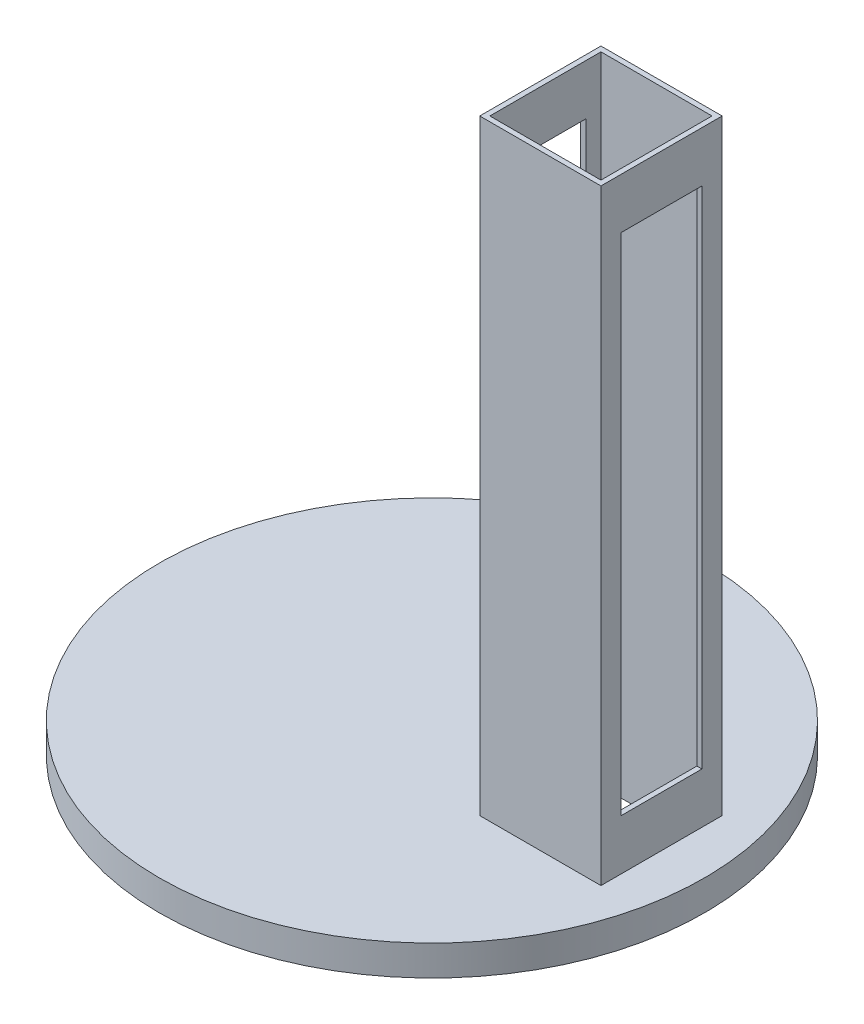
ISO-10303-21;
HEADER;
FILE_DESCRIPTION(('STEP AP214'),'2;1');
FILE_NAME('part.step','',(''),(''),'','','');
FILE_SCHEMA(('AUTOMOTIVE_DESIGN { 1 0 10303 214 1 1 1 1 }'));
ENDSEC;
DATA;
#1=APPLICATION_CONTEXT('core data for automotive mechanical design processes');
#2=APPLICATION_PROTOCOL_DEFINITION('international standard','automotive_design',2000,#1);
#3=PRODUCT_CONTEXT('',#1,'mechanical');
#4=PRODUCT('Part','Part','',(#3));
#5=PRODUCT_RELATED_PRODUCT_CATEGORY('part','',(#4));
#6=PRODUCT_DEFINITION_FORMATION('','',#4);
#7=PRODUCT_DEFINITION_CONTEXT('part definition',#1,'design');
#8=PRODUCT_DEFINITION('design','',#6,#7);
#9=PRODUCT_DEFINITION_SHAPE('','',#8);
#10=(LENGTH_UNIT() NAMED_UNIT(*) SI_UNIT(.MILLI.,.METRE.));
#11=(NAMED_UNIT(*) PLANE_ANGLE_UNIT() SI_UNIT($,.RADIAN.));
#12=(NAMED_UNIT(*) SI_UNIT($,.STERADIAN.) SOLID_ANGLE_UNIT());
#13=UNCERTAINTY_MEASURE_WITH_UNIT(LENGTH_MEASURE(1.E-05),#10,'distance_accuracy_value','');
#14=(GEOMETRIC_REPRESENTATION_CONTEXT(3) GLOBAL_UNCERTAINTY_ASSIGNED_CONTEXT((#13)) GLOBAL_UNIT_ASSIGNED_CONTEXT((#10,
#11,#12)) REPRESENTATION_CONTEXT('',''));
#15=CARTESIAN_POINT('',(0.,0.,0.));
#16=DIRECTION('',(0.,0.,1.));
#17=DIRECTION('',(1.,0.,0.));
#18=AXIS2_PLACEMENT_3D('',#15,#16,#17);
#19=CARTESIAN_POINT('',(0.,3.,0.));
#20=DIRECTION('',(0.,1.,0.));
#21=DIRECTION('',(0.,0.,1.));
#22=AXIS2_PLACEMENT_3D('',#19,#20,#21);
#23=PLANE('',#22);
#24=CARTESIAN_POINT('',(0.,3.,0.));
#25=DIRECTION('',(0.,1.,0.));
#26=DIRECTION('',(0.,0.,1.));
#27=AXIS2_PLACEMENT_3D('',#24,#25,#26);
#28=CIRCLE('',#27,27.);
#29=CARTESIAN_POINT('',(0.,3.,27.));
#30=VERTEX_POINT('',#29);
#31=EDGE_CURVE('E290',#30,#30,#28,.T.);
#32=ORIENTED_EDGE('',*,*,#31,.T.);
#33=EDGE_LOOP('',(#32));
#34=FACE_BOUND('',#33,.T.);
#35=DIRECTION('',(0.,0.,1.));
#36=VECTOR('',#35,1.);
#37=CARTESIAN_POINT('',(22.5279018150798,3.,-6.20837076818439));
#38=LINE('',#37,#36);
#39=CARTESIAN_POINT('',(22.5279018150798,3.,-6.20837076818439));
#40=VERTEX_POINT('',#39);
#41=CARTESIAN_POINT('',(22.5279018150798,3.,5.79162923181561));
#42=VERTEX_POINT('',#41);
#43=EDGE_CURVE('E254',#40,#42,#38,.T.);
#44=ORIENTED_EDGE('',*,*,#43,.T.);
#45=DIRECTION('',(1.,0.,0.));
#46=VECTOR('',#45,1.);
#47=CARTESIAN_POINT('',(10.5279018150798,3.,5.79162923181561));
#48=LINE('',#47,#46);
#49=CARTESIAN_POINT('',(10.5279018150798,3.,5.79162923181561));
#50=VERTEX_POINT('',#49);
#51=EDGE_CURVE('E239',#50,#42,#48,.T.);
#52=ORIENTED_EDGE('',*,*,#51,.F.);
#53=DIRECTION('',(0.,0.,1.));
#54=VECTOR('',#53,1.);
#55=CARTESIAN_POINT('',(10.5279018150798,3.,-6.20837076818439));
#56=LINE('',#55,#54);
#57=CARTESIAN_POINT('',(10.5279018150798,3.,-6.20837076818439));
#58=VERTEX_POINT('',#57);
#59=EDGE_CURVE('E243',#58,#50,#56,.T.);
#60=ORIENTED_EDGE('',*,*,#59,.F.);
#61=DIRECTION('',(1.,0.,0.));
#62=VECTOR('',#61,1.);
#63=CARTESIAN_POINT('',(10.5279018150798,3.,-6.20837076818439));
#64=LINE('',#63,#62);
#65=EDGE_CURVE('E257',#58,#40,#64,.T.);
#66=ORIENTED_EDGE('',*,*,#65,.T.);
#67=EDGE_LOOP('',(#44,#52,#60,#66));
#68=FACE_BOUND('',#67,.T.);
#69=ADVANCED_FACE('F61',(#34,#68),#23,.T.);
#70=CARTESIAN_POINT('',(0.,3.,0.));
#71=DIRECTION('',(0.,-1.,0.));
#72=DIRECTION('',(0.,0.,-1.));
#73=AXIS2_PLACEMENT_3D('',#70,#71,#72);
#74=CYLINDRICAL_SURFACE('',#73,27.);
#75=ORIENTED_EDGE('',*,*,#31,.F.);
#76=EDGE_LOOP('',(#75));
#77=FACE_BOUND('',#76,.T.);
#78=CARTESIAN_POINT('',(0.,0.,0.));
#79=DIRECTION('',(0.,1.,0.));
#80=DIRECTION('',(0.,0.,1.));
#81=AXIS2_PLACEMENT_3D('',#78,#79,#80);
#82=CIRCLE('',#81,27.);
#83=CARTESIAN_POINT('',(0.,0.,27.));
#84=VERTEX_POINT('',#83);
#85=EDGE_CURVE('E284',#84,#84,#82,.T.);
#86=ORIENTED_EDGE('',*,*,#85,.T.);
#87=EDGE_LOOP('',(#86));
#88=FACE_BOUND('',#87,.T.);
#89=ADVANCED_FACE('F63',(#77,#88),#74,.T.);
#90=CARTESIAN_POINT('',(0.,0.,0.));
#91=DIRECTION('',(0.,1.,0.));
#92=DIRECTION('',(0.,0.,1.));
#93=AXIS2_PLACEMENT_3D('',#90,#91,#92);
#94=PLANE('',#93);
#95=DIRECTION('',(0.,0.,-1.));
#96=VECTOR('',#95,1.);
#97=CARTESIAN_POINT('',(22.0279018150798,0.,5.29162923181561));
#98=LINE('',#97,#96);
#99=CARTESIAN_POINT('',(22.0279018150798,0.,5.29162923181561));
#100=VERTEX_POINT('',#99);
#101=CARTESIAN_POINT('',(22.0279018150798,0.,-5.70837076818439));
#102=VERTEX_POINT('',#101);
#103=EDGE_CURVE('E278',#100,#102,#98,.T.);
#104=ORIENTED_EDGE('',*,*,#103,.T.);
#105=DIRECTION('',(-1.,0.,0.));
#106=VECTOR('',#105,1.);
#107=CARTESIAN_POINT('',(22.0279018150798,0.,-5.70837076818439));
#108=LINE('',#107,#106);
#109=CARTESIAN_POINT('',(11.0279018150798,0.,-5.70837076818439));
#110=VERTEX_POINT('',#109);
#111=EDGE_CURVE('E270',#102,#110,#108,.T.);
#112=ORIENTED_EDGE('',*,*,#111,.T.);
#113=DIRECTION('',(0.,0.,-1.));
#114=VECTOR('',#113,1.);
#115=CARTESIAN_POINT('',(11.0279018150798,0.,5.29162923181561));
#116=LINE('',#115,#114);
#117=CARTESIAN_POINT('',(11.0279018150798,0.,5.29162923181561));
#118=VERTEX_POINT('',#117);
#119=EDGE_CURVE('E273',#118,#110,#116,.T.);
#120=ORIENTED_EDGE('',*,*,#119,.F.);
#121=DIRECTION('',(-1.,0.,0.));
#122=VECTOR('',#121,1.);
#123=CARTESIAN_POINT('',(22.0279018150798,0.,5.29162923181561));
#124=LINE('',#123,#122);
#125=EDGE_CURVE('E275',#100,#118,#124,.T.);
#126=ORIENTED_EDGE('',*,*,#125,.F.);
#127=EDGE_LOOP('',(#104,#112,#120,#126));
#128=FACE_BOUND('',#127,.T.);
#129=ORIENTED_EDGE('',*,*,#85,.F.);
#130=EDGE_LOOP('',(#129));
#131=FACE_BOUND('',#130,.T.);
#132=ADVANCED_FACE('F339',(#128,#131),#94,.F.);
#133=CARTESIAN_POINT('',(22.0279018150798,0.,-5.70837076818439));
#134=DIRECTION('',(0.,0.,-1.));
#135=DIRECTION('',(-1.,0.,0.));
#136=AXIS2_PLACEMENT_3D('',#133,#134,#135);
#137=PLANE('',#136);
#138=DIRECTION('',(0.,1.,0.));
#139=VECTOR('',#138,1.);
#140=CARTESIAN_POINT('',(22.0279018150798,0.,-5.70837076818439));
#141=LINE('',#140,#139);
#142=CARTESIAN_POINT('',(22.0279018150798,63.,-5.70837076818439));
#143=VERTEX_POINT('',#142);
#144=EDGE_CURVE('E282',#102,#143,#141,.T.);
#145=ORIENTED_EDGE('',*,*,#144,.T.);
#146=DIRECTION('',(1.,0.,0.));
#147=VECTOR('',#146,1.);
#148=CARTESIAN_POINT('',(11.0279018150798,63.,-5.70837076818439));
#149=LINE('',#148,#147);
#150=CARTESIAN_POINT('',(11.0279018150798,63.,-5.70837076818439));
#151=VERTEX_POINT('',#150);
#152=EDGE_CURVE('E233',#151,#143,#149,.T.);
#153=ORIENTED_EDGE('',*,*,#152,.F.);
#154=DIRECTION('',(0.,1.,0.));
#155=VECTOR('',#154,1.);
#156=CARTESIAN_POINT('',(11.0279018150798,0.,-5.70837076818439));
#157=LINE('',#156,#155);
#158=EDGE_CURVE('E281',#110,#151,#157,.T.);
#159=ORIENTED_EDGE('',*,*,#158,.F.);
#160=ORIENTED_EDGE('',*,*,#111,.F.);
#161=EDGE_LOOP('',(#145,#153,#159,#160));
#162=FACE_BOUND('',#161,.T.);
#163=ADVANCED_FACE('F343',(#162),#137,.F.);
#164=CARTESIAN_POINT('',(22.0279018150798,0.,5.29162923181561));
#165=DIRECTION('',(1.,0.,0.));
#166=DIRECTION('',(0.,0.,-1.));
#167=AXIS2_PLACEMENT_3D('',#164,#165,#166);
#168=PLANE('',#167);
#169=DIRECTION('',(0.,-1.,0.));
#170=VECTOR('',#169,1.);
#171=CARTESIAN_POINT('',(22.0279018150798,0.,3.7916292318156));
#172=LINE('',#171,#170);
#173=CARTESIAN_POINT('',(22.0279018150798,58.,3.79162923181561));
#174=VERTEX_POINT('',#173);
#175=CARTESIAN_POINT('',(22.0279018150798,8.,3.7916292318156));
#176=VERTEX_POINT('',#175);
#177=EDGE_CURVE('E219',#174,#176,#172,.T.);
#178=ORIENTED_EDGE('',*,*,#177,.T.);
#179=DIRECTION('',(0.,0.,-1.));
#180=VECTOR('',#179,1.);
#181=CARTESIAN_POINT('',(22.0279018150798,8.,5.29162923181561));
#182=LINE('',#181,#180);
#183=CARTESIAN_POINT('',(22.0279018150798,8.,-4.2083707681844));
#184=VERTEX_POINT('',#183);
#185=EDGE_CURVE('E224',#176,#184,#182,.T.);
#186=ORIENTED_EDGE('',*,*,#185,.T.);
#187=DIRECTION('',(0.,-1.,0.));
#188=VECTOR('',#187,1.);
#189=CARTESIAN_POINT('',(22.0279018150798,0.,-4.2083707681844));
#190=LINE('',#189,#188);
#191=CARTESIAN_POINT('',(22.0279018150798,58.,-4.20837076818439));
#192=VERTEX_POINT('',#191);
#193=EDGE_CURVE('E211',#192,#184,#190,.T.);
#194=ORIENTED_EDGE('',*,*,#193,.F.);
#195=DIRECTION('',(0.,0.,-1.));
#196=VECTOR('',#195,1.);
#197=CARTESIAN_POINT('',(22.0279018150798,58.,5.29162923181561));
#198=LINE('',#197,#196);
#199=EDGE_CURVE('E179',#174,#192,#198,.T.);
#200=ORIENTED_EDGE('',*,*,#199,.F.);
#201=EDGE_LOOP('',(#178,#186,#194,#200));
#202=FACE_BOUND('',#201,.T.);
#203=DIRECTION('',(0.,1.,0.));
#204=VECTOR('',#203,1.);
#205=CARTESIAN_POINT('',(22.0279018150798,0.,5.29162923181561));
#206=LINE('',#205,#204);
#207=CARTESIAN_POINT('',(22.0279018150798,63.,5.29162923181561));
#208=VERTEX_POINT('',#207);
#209=EDGE_CURVE('E285',#100,#208,#206,.T.);
#210=ORIENTED_EDGE('',*,*,#209,.T.);
#211=DIRECTION('',(0.,0.,1.));
#212=VECTOR('',#211,1.);
#213=CARTESIAN_POINT('',(22.0279018150798,63.,-5.70837076818439));
#214=LINE('',#213,#212);
#215=EDGE_CURVE('E230',#143,#208,#214,.T.);
#216=ORIENTED_EDGE('',*,*,#215,.F.);
#217=ORIENTED_EDGE('',*,*,#144,.F.);
#218=ORIENTED_EDGE('',*,*,#103,.F.);
#219=EDGE_LOOP('',(#210,#216,#217,#218));
#220=FACE_BOUND('',#219,.T.);
#221=ADVANCED_FACE('F350',(#202,#220),#168,.F.);
#222=CARTESIAN_POINT('',(22.0279018150798,0.,5.29162923181561));
#223=DIRECTION('',(0.,0.,-1.));
#224=DIRECTION('',(-1.,0.,0.));
#225=AXIS2_PLACEMENT_3D('',#222,#223,#224);
#226=PLANE('',#225);
#227=DIRECTION('',(0.,1.,0.));
#228=VECTOR('',#227,1.);
#229=CARTESIAN_POINT('',(11.0279018150798,0.,5.29162923181561));
#230=LINE('',#229,#228);
#231=CARTESIAN_POINT('',(11.0279018150798,63.,5.29162923181561));
#232=VERTEX_POINT('',#231);
#233=EDGE_CURVE('E287',#118,#232,#230,.T.);
#234=ORIENTED_EDGE('',*,*,#233,.T.);
#235=DIRECTION('',(1.,0.,0.));
#236=VECTOR('',#235,1.);
#237=CARTESIAN_POINT('',(11.0279018150798,63.,5.29162923181561));
#238=LINE('',#237,#236);
#239=EDGE_CURVE('E227',#232,#208,#238,.T.);
#240=ORIENTED_EDGE('',*,*,#239,.T.);
#241=ORIENTED_EDGE('',*,*,#209,.F.);
#242=ORIENTED_EDGE('',*,*,#125,.T.);
#243=EDGE_LOOP('',(#234,#240,#241,#242));
#244=FACE_BOUND('',#243,.T.);
#245=ADVANCED_FACE('F366',(#244),#226,.T.);
#246=CARTESIAN_POINT('',(11.0279018150798,0.,5.29162923181561));
#247=DIRECTION('',(1.,0.,0.));
#248=DIRECTION('',(0.,0.,-1.));
#249=AXIS2_PLACEMENT_3D('',#246,#247,#248);
#250=PLANE('',#249);
#251=DIRECTION('',(0.,0.,-1.));
#252=VECTOR('',#251,1.);
#253=CARTESIAN_POINT('',(11.0279018150798,8.,5.29162923181561));
#254=LINE('',#253,#252);
#255=CARTESIAN_POINT('',(11.0279018150798,8.,3.7916292318156));
#256=VERTEX_POINT('',#255);
#257=CARTESIAN_POINT('',(11.0279018150798,8.,-4.20837076818439));
#258=VERTEX_POINT('',#257);
#259=EDGE_CURVE('E222',#256,#258,#254,.T.);
#260=ORIENTED_EDGE('',*,*,#259,.F.);
#261=DIRECTION('',(0.,-1.,0.));
#262=VECTOR('',#261,1.);
#263=CARTESIAN_POINT('',(11.0279018150798,0.,3.7916292318156));
#264=LINE('',#263,#262);
#265=CARTESIAN_POINT('',(11.0279018150798,58.,3.79162923181561));
#266=VERTEX_POINT('',#265);
#267=EDGE_CURVE('E217',#266,#256,#264,.T.);
#268=ORIENTED_EDGE('',*,*,#267,.F.);
#269=DIRECTION('',(0.,0.,-1.));
#270=VECTOR('',#269,1.);
#271=CARTESIAN_POINT('',(11.0279018150798,58.,5.29162923181561));
#272=LINE('',#271,#270);
#273=CARTESIAN_POINT('',(11.0279018150798,58.,-4.20837076818439));
#274=VERTEX_POINT('',#273);
#275=EDGE_CURVE('E213',#266,#274,#272,.T.);
#276=ORIENTED_EDGE('',*,*,#275,.T.);
#277=DIRECTION('',(0.,-1.,0.));
#278=VECTOR('',#277,1.);
#279=CARTESIAN_POINT('',(11.0279018150798,0.,-4.2083707681844));
#280=LINE('',#279,#278);
#281=EDGE_CURVE('E208',#274,#258,#280,.T.);
#282=ORIENTED_EDGE('',*,*,#281,.T.);
#283=EDGE_LOOP('',(#260,#268,#276,#282));
#284=FACE_BOUND('',#283,.T.);
#285=ORIENTED_EDGE('',*,*,#158,.T.);
#286=DIRECTION('',(0.,0.,1.));
#287=VECTOR('',#286,1.);
#288=CARTESIAN_POINT('',(11.0279018150798,63.,-5.70837076818439));
#289=LINE('',#288,#287);
#290=EDGE_CURVE('E236',#151,#232,#289,.T.);
#291=ORIENTED_EDGE('',*,*,#290,.T.);
#292=ORIENTED_EDGE('',*,*,#233,.F.);
#293=ORIENTED_EDGE('',*,*,#119,.T.);
#294=EDGE_LOOP('',(#285,#291,#292,#293));
#295=FACE_BOUND('',#294,.T.);
#296=ADVANCED_FACE('F317',(#284,#295),#250,.T.);
#297=CARTESIAN_POINT('',(0.,63.,0.));
#298=DIRECTION('',(0.,-1.,0.));
#299=DIRECTION('',(0.,0.,-1.));
#300=AXIS2_PLACEMENT_3D('',#297,#298,#299);
#301=PLANE('',#300);
#302=DIRECTION('',(1.,0.,0.));
#303=VECTOR('',#302,1.);
#304=CARTESIAN_POINT('',(10.5279018150798,63.,5.79162923181561));
#305=LINE('',#304,#303);
#306=CARTESIAN_POINT('',(10.5279018150798,63.,5.79162923181561));
#307=VERTEX_POINT('',#306);
#308=CARTESIAN_POINT('',(22.5279018150798,63.,5.79162923181561));
#309=VERTEX_POINT('',#308);
#310=EDGE_CURVE('E240',#307,#309,#305,.T.);
#311=ORIENTED_EDGE('',*,*,#310,.T.);
#312=DIRECTION('',(0.,0.,1.));
#313=VECTOR('',#312,1.);
#314=CARTESIAN_POINT('',(22.5279018150798,63.,-6.20837076818439));
#315=LINE('',#314,#313);
#316=CARTESIAN_POINT('',(22.5279018150798,63.,-6.20837076818439));
#317=VERTEX_POINT('',#316);
#318=EDGE_CURVE('E242',#317,#309,#315,.T.);
#319=ORIENTED_EDGE('',*,*,#318,.F.);
#320=DIRECTION('',(1.,0.,0.));
#321=VECTOR('',#320,1.);
#322=CARTESIAN_POINT('',(10.5279018150798,63.,-6.20837076818439));
#323=LINE('',#322,#321);
#324=CARTESIAN_POINT('',(10.5279018150798,63.,-6.20837076818439));
#325=VERTEX_POINT('',#324);
#326=EDGE_CURVE('E246',#325,#317,#323,.T.);
#327=ORIENTED_EDGE('',*,*,#326,.F.);
#328=DIRECTION('',(0.,0.,1.));
#329=VECTOR('',#328,1.);
#330=CARTESIAN_POINT('',(10.5279018150798,63.,-6.20837076818439));
#331=LINE('',#330,#329);
#332=EDGE_CURVE('E249',#325,#307,#331,.T.);
#333=ORIENTED_EDGE('',*,*,#332,.T.);
#334=EDGE_LOOP('',(#311,#319,#327,#333));
#335=FACE_BOUND('',#334,.T.);
#336=ORIENTED_EDGE('',*,*,#239,.F.);
#337=ORIENTED_EDGE('',*,*,#290,.F.);
#338=ORIENTED_EDGE('',*,*,#152,.T.);
#339=ORIENTED_EDGE('',*,*,#215,.T.);
#340=EDGE_LOOP('',(#336,#337,#338,#339));
#341=FACE_BOUND('',#340,.T.);
#342=ADVANCED_FACE('F368',(#335,#341),#301,.F.);
#343=CARTESIAN_POINT('',(10.5279018150798,63.,5.79162923181561));
#344=DIRECTION('',(0.,0.,-1.));
#345=DIRECTION('',(-1.,0.,0.));
#346=AXIS2_PLACEMENT_3D('',#343,#344,#345);
#347=PLANE('',#346);
#348=ORIENTED_EDGE('',*,*,#51,.T.);
#349=DIRECTION('',(0.,-1.,0.));
#350=VECTOR('',#349,1.);
#351=CARTESIAN_POINT('',(22.5279018150798,63.,5.79162923181561));
#352=LINE('',#351,#350);
#353=EDGE_CURVE('E268',#309,#42,#352,.T.);
#354=ORIENTED_EDGE('',*,*,#353,.F.);
#355=ORIENTED_EDGE('',*,*,#310,.F.);
#356=DIRECTION('',(0.,-1.,0.));
#357=VECTOR('',#356,1.);
#358=CARTESIAN_POINT('',(10.5279018150798,63.,5.79162923181561));
#359=LINE('',#358,#357);
#360=EDGE_CURVE('E251',#307,#50,#359,.T.);
#361=ORIENTED_EDGE('',*,*,#360,.T.);
#362=EDGE_LOOP('',(#348,#354,#355,#361));
#363=FACE_BOUND('',#362,.T.);
#364=ADVANCED_FACE('F370',(#363),#347,.F.);
#365=CARTESIAN_POINT('',(22.5279018150798,63.,-6.20837076818439));
#366=DIRECTION('',(1.,0.,0.));
#367=DIRECTION('',(0.,0.,-1.));
#368=AXIS2_PLACEMENT_3D('',#365,#366,#367);
#369=PLANE('',#368);
#370=DIRECTION('',(0.,0.,-1.));
#371=VECTOR('',#370,1.);
#372=CARTESIAN_POINT('',(22.5279018150798,8.,3.7916292318156));
#373=LINE('',#372,#371);
#374=CARTESIAN_POINT('',(22.5279018150798,8.,3.7916292318156));
#375=VERTEX_POINT('',#374);
#376=CARTESIAN_POINT('',(22.5279018150798,8.,-4.2083707681844));
#377=VERTEX_POINT('',#376);
#378=EDGE_CURVE('E191',#375,#377,#373,.T.);
#379=ORIENTED_EDGE('',*,*,#378,.F.);
#380=DIRECTION('',(0.,-1.,0.));
#381=VECTOR('',#380,1.);
#382=CARTESIAN_POINT('',(22.5279018150798,58.,3.79162923181561));
#383=LINE('',#382,#381);
#384=CARTESIAN_POINT('',(22.5279018150798,58.,3.79162923181561));
#385=VERTEX_POINT('',#384);
#386=EDGE_CURVE('E196',#385,#375,#383,.T.);
#387=ORIENTED_EDGE('',*,*,#386,.F.);
#388=DIRECTION('',(0.,0.,-1.));
#389=VECTOR('',#388,1.);
#390=CARTESIAN_POINT('',(22.5279018150798,58.,3.79162923181561));
#391=LINE('',#390,#389);
#392=CARTESIAN_POINT('',(22.5279018150798,58.,-4.20837076818439));
#393=VERTEX_POINT('',#392);
#394=EDGE_CURVE('E176',#385,#393,#391,.T.);
#395=ORIENTED_EDGE('',*,*,#394,.T.);
#396=DIRECTION('',(0.,-1.,0.));
#397=VECTOR('',#396,1.);
#398=CARTESIAN_POINT('',(22.5279018150798,58.,-4.20837076818439));
#399=LINE('',#398,#397);
#400=EDGE_CURVE('E185',#393,#377,#399,.T.);
#401=ORIENTED_EDGE('',*,*,#400,.T.);
#402=EDGE_LOOP('',(#379,#387,#395,#401));
#403=FACE_BOUND('',#402,.T.);
#404=ORIENTED_EDGE('',*,*,#43,.F.);
#405=DIRECTION('',(0.,-1.,0.));
#406=VECTOR('',#405,1.);
#407=CARTESIAN_POINT('',(22.5279018150798,63.,-6.20837076818439));
#408=LINE('',#407,#406);
#409=EDGE_CURVE('E266',#317,#40,#408,.T.);
#410=ORIENTED_EDGE('',*,*,#409,.F.);
#411=ORIENTED_EDGE('',*,*,#318,.T.);
#412=ORIENTED_EDGE('',*,*,#353,.T.);
#413=EDGE_LOOP('',(#404,#410,#411,#412));
#414=FACE_BOUND('',#413,.T.);
#415=ADVANCED_FACE('F193',(#403,#414),#369,.T.);
#416=CARTESIAN_POINT('',(10.5279018150798,63.,-6.20837076818439));
#417=DIRECTION('',(0.,0.,-1.));
#418=DIRECTION('',(-1.,0.,0.));
#419=AXIS2_PLACEMENT_3D('',#416,#417,#418);
#420=PLANE('',#419);
#421=ORIENTED_EDGE('',*,*,#65,.F.);
#422=DIRECTION('',(0.,-1.,0.));
#423=VECTOR('',#422,1.);
#424=CARTESIAN_POINT('',(10.5279018150798,63.,-6.20837076818439));
#425=LINE('',#424,#423);
#426=EDGE_CURVE('E263',#325,#58,#425,.T.);
#427=ORIENTED_EDGE('',*,*,#426,.F.);
#428=ORIENTED_EDGE('',*,*,#326,.T.);
#429=ORIENTED_EDGE('',*,*,#409,.T.);
#430=EDGE_LOOP('',(#421,#427,#428,#429));
#431=FACE_BOUND('',#430,.T.);
#432=ADVANCED_FACE('F382',(#431),#420,.T.);
#433=CARTESIAN_POINT('',(10.5279018150798,63.,-6.20837076818439));
#434=DIRECTION('',(1.,0.,0.));
#435=DIRECTION('',(0.,0.,-1.));
#436=AXIS2_PLACEMENT_3D('',#433,#434,#435);
#437=PLANE('',#436);
#438=DIRECTION('',(0.,-1.,0.));
#439=VECTOR('',#438,1.);
#440=CARTESIAN_POINT('',(10.5279018150798,63.,3.79162923181561));
#441=LINE('',#440,#439);
#442=CARTESIAN_POINT('',(10.5279018150798,58.,3.79162923181561));
#443=VERTEX_POINT('',#442);
#444=CARTESIAN_POINT('',(10.5279018150798,8.,3.7916292318156));
#445=VERTEX_POINT('',#444);
#446=EDGE_CURVE('E69',#443,#445,#441,.T.);
#447=ORIENTED_EDGE('',*,*,#446,.T.);
#448=DIRECTION('',(0.,0.,-1.));
#449=VECTOR('',#448,1.);
#450=CARTESIAN_POINT('',(10.5279018150798,8.,-6.20837076818438));
#451=LINE('',#450,#449);
#452=CARTESIAN_POINT('',(10.5279018150798,8.,-4.2083707681844));
#453=VERTEX_POINT('',#452);
#454=EDGE_CURVE('E12',#445,#453,#451,.T.);
#455=ORIENTED_EDGE('',*,*,#454,.T.);
#456=DIRECTION('',(0.,-1.,0.));
#457=VECTOR('',#456,1.);
#458=CARTESIAN_POINT('',(10.5279018150798,63.,-4.20837076818439));
#459=LINE('',#458,#457);
#460=CARTESIAN_POINT('',(10.5279018150798,58.,-4.20837076818439));
#461=VERTEX_POINT('',#460);
#462=EDGE_CURVE('E293',#461,#453,#459,.T.);
#463=ORIENTED_EDGE('',*,*,#462,.F.);
#464=DIRECTION('',(0.,0.,-1.));
#465=VECTOR('',#464,1.);
#466=CARTESIAN_POINT('',(10.5279018150798,58.,-6.20837076818439));
#467=LINE('',#466,#465);
#468=EDGE_CURVE('E297',#443,#461,#467,.T.);
#469=ORIENTED_EDGE('',*,*,#468,.F.);
#470=EDGE_LOOP('',(#447,#455,#463,#469));
#471=FACE_BOUND('',#470,.T.);
#472=ORIENTED_EDGE('',*,*,#59,.T.);
#473=ORIENTED_EDGE('',*,*,#360,.F.);
#474=ORIENTED_EDGE('',*,*,#332,.F.);
#475=ORIENTED_EDGE('',*,*,#426,.T.);
#476=EDGE_LOOP('',(#472,#473,#474,#475));
#477=FACE_BOUND('',#476,.T.);
#478=ADVANCED_FACE('F302',(#471,#477),#437,.F.);
#479=CARTESIAN_POINT('',(-37.4720981849202,58.,-4.20837076818439));
#480=DIRECTION('',(0.,0.,1.));
#481=DIRECTION('',(0.,-1.,0.));
#482=AXIS2_PLACEMENT_3D('',#479,#480,#481);
#483=PLANE('',#482);
#484=DIRECTION('',(1.,0.,0.));
#485=VECTOR('',#484,1.);
#486=CARTESIAN_POINT('',(-37.4720981849202,58.,-4.20837076818439));
#487=LINE('',#486,#485);
#488=EDGE_CURVE('E181',#461,#274,#487,.T.);
#489=ORIENTED_EDGE('',*,*,#488,.F.);
#490=ORIENTED_EDGE('',*,*,#462,.T.);
#491=DIRECTION('',(1.,0.,0.));
#492=VECTOR('',#491,1.);
#493=CARTESIAN_POINT('',(-37.4720981849202,8.,-4.2083707681844));
#494=LINE('',#493,#492);
#495=EDGE_CURVE('E84',#453,#258,#494,.T.);
#496=ORIENTED_EDGE('',*,*,#495,.T.);
#497=ORIENTED_EDGE('',*,*,#281,.F.);
#498=EDGE_LOOP('',(#489,#490,#496,#497));
#499=FACE_BOUND('',#498,.T.);
#500=ADVANCED_FACE('F381',(#499),#483,.T.);
#501=CARTESIAN_POINT('',(-37.4720981849202,58.,3.79162923181561));
#502=DIRECTION('',(0.,-1.,0.));
#503=DIRECTION('',(0.,0.,-1.));
#504=AXIS2_PLACEMENT_3D('',#501,#502,#503);
#505=PLANE('',#504);
#506=DIRECTION('',(1.,0.,0.));
#507=VECTOR('',#506,1.);
#508=CARTESIAN_POINT('',(-37.4720981849202,58.,3.79162923181561));
#509=LINE('',#508,#507);
#510=EDGE_CURVE('E204',#443,#266,#509,.T.);
#511=ORIENTED_EDGE('',*,*,#510,.F.);
#512=ORIENTED_EDGE('',*,*,#468,.T.);
#513=ORIENTED_EDGE('',*,*,#488,.T.);
#514=ORIENTED_EDGE('',*,*,#275,.F.);
#515=EDGE_LOOP('',(#511,#512,#513,#514));
#516=FACE_BOUND('',#515,.T.);
#517=ADVANCED_FACE('F313',(#516),#505,.T.);
#518=CARTESIAN_POINT('',(-37.4720981849202,58.,3.79162923181561));
#519=DIRECTION('',(0.,0.,1.));
#520=DIRECTION('',(0.,-1.,0.));
#521=AXIS2_PLACEMENT_3D('',#518,#519,#520);
#522=PLANE('',#521);
#523=ORIENTED_EDGE('',*,*,#267,.T.);
#524=DIRECTION('',(1.,0.,0.));
#525=VECTOR('',#524,1.);
#526=CARTESIAN_POINT('',(-37.4720981849202,8.,3.7916292318156));
#527=LINE('',#526,#525);
#528=EDGE_CURVE('E203',#445,#256,#527,.T.);
#529=ORIENTED_EDGE('',*,*,#528,.F.);
#530=ORIENTED_EDGE('',*,*,#446,.F.);
#531=ORIENTED_EDGE('',*,*,#510,.T.);
#532=EDGE_LOOP('',(#523,#529,#530,#531));
#533=FACE_BOUND('',#532,.T.);
#534=ADVANCED_FACE('F309',(#533),#522,.F.);
#535=CARTESIAN_POINT('',(-37.4720981849202,8.,3.7916292318156));
#536=DIRECTION('',(0.,-1.,0.));
#537=DIRECTION('',(0.,0.,-1.));
#538=AXIS2_PLACEMENT_3D('',#535,#536,#537);
#539=PLANE('',#538);
#540=ORIENTED_EDGE('',*,*,#259,.T.);
#541=ORIENTED_EDGE('',*,*,#495,.F.);
#542=ORIENTED_EDGE('',*,*,#454,.F.);
#543=ORIENTED_EDGE('',*,*,#528,.T.);
#544=EDGE_LOOP('',(#540,#541,#542,#543));
#545=FACE_BOUND('',#544,.T.);
#546=ADVANCED_FACE('F320',(#545),#539,.F.);
#547=EDGE_CURVE('E201',#176,#375,#527,.T.);
#548=ORIENTED_EDGE('',*,*,#547,.T.);
#549=ORIENTED_EDGE('',*,*,#378,.T.);
#550=EDGE_CURVE('E188',#184,#377,#494,.T.);
#551=ORIENTED_EDGE('',*,*,#550,.F.);
#552=ORIENTED_EDGE('',*,*,#185,.F.);
#553=EDGE_LOOP('',(#548,#549,#551,#552));
#554=FACE_BOUND('',#553,.T.);
#555=ADVANCED_FACE('F322',(#554),#539,.F.);
#556=EDGE_CURVE('E205',#174,#385,#509,.T.);
#557=ORIENTED_EDGE('',*,*,#556,.T.);
#558=ORIENTED_EDGE('',*,*,#386,.T.);
#559=ORIENTED_EDGE('',*,*,#547,.F.);
#560=ORIENTED_EDGE('',*,*,#177,.F.);
#561=EDGE_LOOP('',(#557,#558,#559,#560));
#562=FACE_BOUND('',#561,.T.);
#563=ADVANCED_FACE('F328',(#562),#522,.F.);
#564=ORIENTED_EDGE('',*,*,#199,.T.);
#565=EDGE_CURVE('E76',#192,#393,#487,.T.);
#566=ORIENTED_EDGE('',*,*,#565,.T.);
#567=ORIENTED_EDGE('',*,*,#394,.F.);
#568=ORIENTED_EDGE('',*,*,#556,.F.);
#569=EDGE_LOOP('',(#564,#566,#567,#568));
#570=FACE_BOUND('',#569,.T.);
#571=ADVANCED_FACE('F173',(#570),#505,.T.);
#572=ORIENTED_EDGE('',*,*,#193,.T.);
#573=ORIENTED_EDGE('',*,*,#550,.T.);
#574=ORIENTED_EDGE('',*,*,#400,.F.);
#575=ORIENTED_EDGE('',*,*,#565,.F.);
#576=EDGE_LOOP('',(#572,#573,#574,#575));
#577=FACE_BOUND('',#576,.T.);
#578=ADVANCED_FACE('F186',(#577),#483,.T.);
#579=CLOSED_SHELL('',(#69,#89,#132,#163,#221,#245,#296,#342,#364,#415,#432,#478,#500,#517,#534,
#546,#555,#563,#571,#578));
#580=MANIFOLD_SOLID_BREP('B2',#579);
#581=ADVANCED_BREP_SHAPE_REPRESENTATION('',(#18,#580),#14);
#582=SHAPE_DEFINITION_REPRESENTATION(#9,#581);
ENDSEC;
END-ISO-10303-21;
